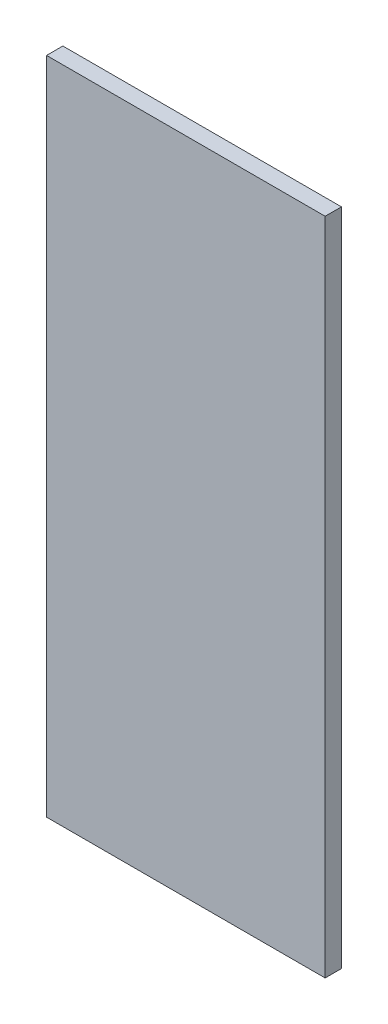
ISO-10303-21;
HEADER;
FILE_DESCRIPTION(('STEP AP214'),'2;1');
FILE_NAME('part.step','',(''),(''),'','','');
FILE_SCHEMA(('AUTOMOTIVE_DESIGN { 1 0 10303 214 1 1 1 1 }'));
ENDSEC;
DATA;
#1=APPLICATION_CONTEXT('core data for automotive mechanical design processes');
#2=APPLICATION_PROTOCOL_DEFINITION('international standard','automotive_design',2000,#1);
#3=PRODUCT_CONTEXT('',#1,'mechanical');
#4=PRODUCT('Part','Part','',(#3));
#5=PRODUCT_RELATED_PRODUCT_CATEGORY('part','',(#4));
#6=PRODUCT_DEFINITION_FORMATION('','',#4);
#7=PRODUCT_DEFINITION_CONTEXT('part definition',#1,'design');
#8=PRODUCT_DEFINITION('design','',#6,#7);
#9=PRODUCT_DEFINITION_SHAPE('','',#8);
#10=(LENGTH_UNIT() NAMED_UNIT(*) SI_UNIT(.MILLI.,.METRE.));
#11=(NAMED_UNIT(*) PLANE_ANGLE_UNIT() SI_UNIT($,.RADIAN.));
#12=(NAMED_UNIT(*) SI_UNIT($,.STERADIAN.) SOLID_ANGLE_UNIT());
#13=UNCERTAINTY_MEASURE_WITH_UNIT(LENGTH_MEASURE(1.E-05),#10,'distance_accuracy_value','');
#14=(GEOMETRIC_REPRESENTATION_CONTEXT(3) GLOBAL_UNCERTAINTY_ASSIGNED_CONTEXT((#13)) GLOBAL_UNIT_ASSIGNED_CONTEXT((#10,
#11,#12)) REPRESENTATION_CONTEXT('',''));
#15=CARTESIAN_POINT('',(0.,0.,0.));
#16=DIRECTION('',(0.,0.,1.));
#17=DIRECTION('',(1.,0.,0.));
#18=AXIS2_PLACEMENT_3D('',#15,#16,#17);
#19=CARTESIAN_POINT('',(334.335599293086,0.,10.16));
#20=DIRECTION('',(-1.,0.,0.));
#21=DIRECTION('',(0.,-1.,0.));
#22=AXIS2_PLACEMENT_3D('',#19,#20,#21);
#23=PLANE('',#22);
#24=DIRECTION('',(0.,1.,0.));
#25=VECTOR('',#24,1.);
#26=CARTESIAN_POINT('',(334.335599293086,0.,0.));
#27=LINE('',#26,#25);
#28=CARTESIAN_POINT('',(334.335599293086,-411.430597606027,0.));
#29=VERTEX_POINT('',#28);
#30=CARTESIAN_POINT('',(334.335599293086,0.,0.));
#31=VERTEX_POINT('',#30);
#32=EDGE_CURVE('E100',#29,#31,#27,.T.);
#33=ORIENTED_EDGE('',*,*,#32,.T.);
#34=DIRECTION('',(0.,0.,-1.));
#35=VECTOR('',#34,1.);
#36=CARTESIAN_POINT('',(334.335599293086,0.,10.16));
#37=LINE('',#36,#35);
#38=CARTESIAN_POINT('',(334.335599293086,0.,10.16));
#39=VERTEX_POINT('',#38);
#40=EDGE_CURVE('E11',#39,#31,#37,.T.);
#41=ORIENTED_EDGE('',*,*,#40,.F.);
#42=DIRECTION('',(0.,1.,0.));
#43=VECTOR('',#42,1.);
#44=CARTESIAN_POINT('',(334.335599293086,0.,10.16));
#45=LINE('',#44,#43);
#46=CARTESIAN_POINT('',(334.335599293086,-411.430597606027,10.16));
#47=VERTEX_POINT('',#46);
#48=EDGE_CURVE('E88',#47,#39,#45,.T.);
#49=ORIENTED_EDGE('',*,*,#48,.F.);
#50=DIRECTION('',(0.,0.,-1.));
#51=VECTOR('',#50,1.);
#52=CARTESIAN_POINT('',(334.335599293086,-411.430597606027,10.16));
#53=LINE('',#52,#51);
#54=EDGE_CURVE('E96',#47,#29,#53,.T.);
#55=ORIENTED_EDGE('',*,*,#54,.T.);
#56=EDGE_LOOP('',(#33,#41,#49,#55));
#57=FACE_BOUND('',#56,.T.);
#58=ADVANCED_FACE('F37',(#57),#23,.F.);
#59=CARTESIAN_POINT('',(334.335599293086,0.,10.16));
#60=DIRECTION('',(0.,-1.,0.));
#61=DIRECTION('',(0.,0.,-1.));
#62=AXIS2_PLACEMENT_3D('',#59,#60,#61);
#63=PLANE('',#62);
#64=DIRECTION('',(-1.,0.,0.));
#65=VECTOR('',#64,1.);
#66=CARTESIAN_POINT('',(334.335599293086,0.,0.));
#67=LINE('',#66,#65);
#68=CARTESIAN_POINT('',(160.588740867647,0.,0.));
#69=VERTEX_POINT('',#68);
#70=EDGE_CURVE('E92',#31,#69,#67,.T.);
#71=ORIENTED_EDGE('',*,*,#70,.T.);
#72=DIRECTION('',(0.,0.,-1.));
#73=VECTOR('',#72,1.);
#74=CARTESIAN_POINT('',(160.588740867647,0.,10.16));
#75=LINE('',#74,#73);
#76=CARTESIAN_POINT('',(160.588740867647,0.,10.16));
#77=VERTEX_POINT('',#76);
#78=EDGE_CURVE('E45',#77,#69,#75,.T.);
#79=ORIENTED_EDGE('',*,*,#78,.F.);
#80=DIRECTION('',(-1.,0.,0.));
#81=VECTOR('',#80,1.);
#82=CARTESIAN_POINT('',(334.335599293086,0.,10.16));
#83=LINE('',#82,#81);
#84=EDGE_CURVE('E83',#39,#77,#83,.T.);
#85=ORIENTED_EDGE('',*,*,#84,.F.);
#86=ORIENTED_EDGE('',*,*,#40,.T.);
#87=EDGE_LOOP('',(#71,#79,#85,#86));
#88=FACE_BOUND('',#87,.T.);
#89=ADVANCED_FACE('F91',(#88),#63,.F.);
#90=CARTESIAN_POINT('',(160.588740867647,0.,10.16));
#91=DIRECTION('',(1.,0.,0.));
#92=DIRECTION('',(0.,1.,0.));
#93=AXIS2_PLACEMENT_3D('',#90,#91,#92);
#94=PLANE('',#93);
#95=DIRECTION('',(0.,-1.,0.));
#96=VECTOR('',#95,1.);
#97=CARTESIAN_POINT('',(160.588740867647,0.,0.));
#98=LINE('',#97,#96);
#99=CARTESIAN_POINT('',(160.588740867647,-411.430597606027,0.));
#100=VERTEX_POINT('',#99);
#101=EDGE_CURVE('E70',#69,#100,#98,.T.);
#102=ORIENTED_EDGE('',*,*,#101,.T.);
#103=DIRECTION('',(0.,0.,-1.));
#104=VECTOR('',#103,1.);
#105=CARTESIAN_POINT('',(160.588740867647,-411.430597606027,10.16));
#106=LINE('',#105,#104);
#107=CARTESIAN_POINT('',(160.588740867647,-411.430597606027,10.16));
#108=VERTEX_POINT('',#107);
#109=EDGE_CURVE('E93',#108,#100,#106,.T.);
#110=ORIENTED_EDGE('',*,*,#109,.F.);
#111=DIRECTION('',(0.,-1.,0.));
#112=VECTOR('',#111,1.);
#113=CARTESIAN_POINT('',(160.588740867647,0.,10.16));
#114=LINE('',#113,#112);
#115=EDGE_CURVE('E86',#77,#108,#114,.T.);
#116=ORIENTED_EDGE('',*,*,#115,.F.);
#117=ORIENTED_EDGE('',*,*,#78,.T.);
#118=EDGE_LOOP('',(#102,#110,#116,#117));
#119=FACE_BOUND('',#118,.T.);
#120=ADVANCED_FACE('F94',(#119),#94,.F.);
#121=CARTESIAN_POINT('',(334.335599293086,-411.430597606027,10.16));
#122=DIRECTION('',(0.,1.,0.));
#123=DIRECTION('',(-1.,0.,0.));
#124=AXIS2_PLACEMENT_3D('',#121,#122,#123);
#125=PLANE('',#124);
#126=DIRECTION('',(1.,0.,0.));
#127=VECTOR('',#126,1.);
#128=CARTESIAN_POINT('',(334.335599293086,-411.430597606027,0.));
#129=LINE('',#128,#127);
#130=EDGE_CURVE('E76',#100,#29,#129,.T.);
#131=ORIENTED_EDGE('',*,*,#130,.T.);
#132=ORIENTED_EDGE('',*,*,#54,.F.);
#133=DIRECTION('',(1.,0.,0.));
#134=VECTOR('',#133,1.);
#135=CARTESIAN_POINT('',(334.335599293086,-411.430597606027,10.16));
#136=LINE('',#135,#134);
#137=EDGE_CURVE('E53',#108,#47,#136,.T.);
#138=ORIENTED_EDGE('',*,*,#137,.F.);
#139=ORIENTED_EDGE('',*,*,#109,.T.);
#140=EDGE_LOOP('',(#131,#132,#138,#139));
#141=FACE_BOUND('',#140,.T.);
#142=ADVANCED_FACE('F107',(#141),#125,.F.);
#143=CARTESIAN_POINT('',(0.,0.,10.16));
#144=DIRECTION('',(0.,0.,-1.));
#145=DIRECTION('',(-1.,0.,0.));
#146=AXIS2_PLACEMENT_3D('',#143,#144,#145);
#147=PLANE('',#146);
#148=ORIENTED_EDGE('',*,*,#48,.T.);
#149=ORIENTED_EDGE('',*,*,#84,.T.);
#150=ORIENTED_EDGE('',*,*,#115,.T.);
#151=ORIENTED_EDGE('',*,*,#137,.T.);
#152=EDGE_LOOP('',(#148,#149,#150,#151));
#153=FACE_BOUND('',#152,.T.);
#154=ADVANCED_FACE('F84',(#153),#147,.F.);
#155=CARTESIAN_POINT('',(0.,0.,0.));
#156=DIRECTION('',(0.,0.,-1.));
#157=DIRECTION('',(-1.,0.,0.));
#158=AXIS2_PLACEMENT_3D('',#155,#156,#157);
#159=PLANE('',#158);
#160=ORIENTED_EDGE('',*,*,#32,.F.);
#161=ORIENTED_EDGE('',*,*,#130,.F.);
#162=ORIENTED_EDGE('',*,*,#101,.F.);
#163=ORIENTED_EDGE('',*,*,#70,.F.);
#164=EDGE_LOOP('',(#160,#161,#162,#163));
#165=FACE_BOUND('',#164,.T.);
#166=ADVANCED_FACE('F110',(#165),#159,.T.);
#167=CLOSED_SHELL('',(#58,#89,#120,#142,#154,#166));
#168=MANIFOLD_SOLID_BREP('B2',#167);
#169=ADVANCED_BREP_SHAPE_REPRESENTATION('',(#18,#168),#14);
#170=SHAPE_DEFINITION_REPRESENTATION(#9,#169);
ENDSEC;
END-ISO-10303-21;
